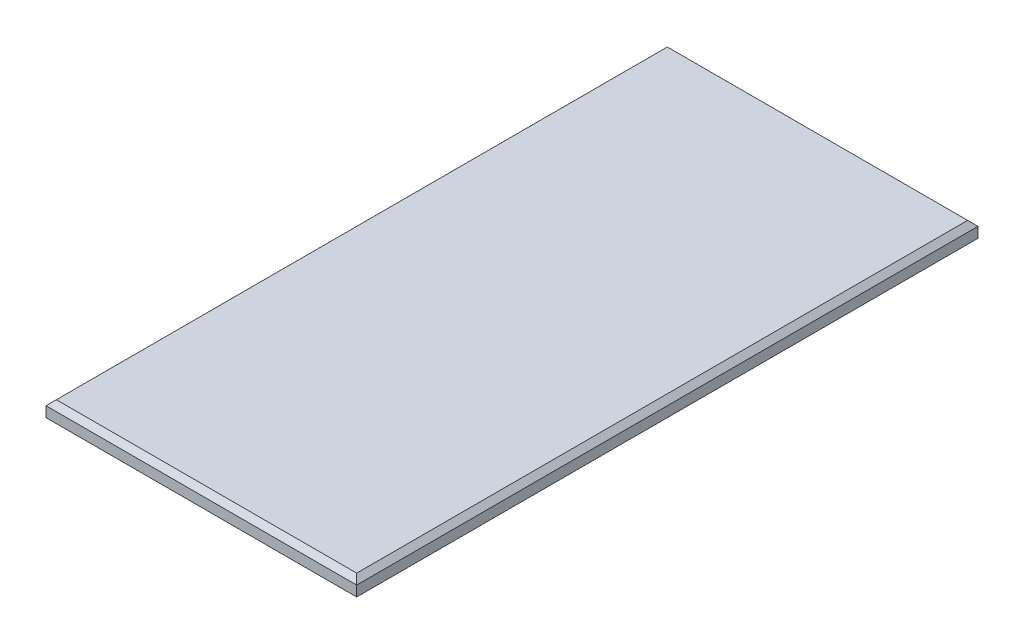
ISO-10303-21;
HEADER;
FILE_DESCRIPTION(('STEP AP214'),'2;1');
FILE_NAME('part.step','',(''),(''),'','','');
FILE_SCHEMA(('AUTOMOTIVE_DESIGN { 1 0 10303 214 1 1 1 1 }'));
ENDSEC;
DATA;
#1=APPLICATION_CONTEXT('core data for automotive mechanical design processes');
#2=APPLICATION_PROTOCOL_DEFINITION('international standard','automotive_design',2000,#1);
#3=PRODUCT_CONTEXT('',#1,'mechanical');
#4=PRODUCT('Part','Part','',(#3));
#5=PRODUCT_RELATED_PRODUCT_CATEGORY('part','',(#4));
#6=PRODUCT_DEFINITION_FORMATION('','',#4);
#7=PRODUCT_DEFINITION_CONTEXT('part definition',#1,'design');
#8=PRODUCT_DEFINITION('design','',#6,#7);
#9=PRODUCT_DEFINITION_SHAPE('','',#8);
#10=(LENGTH_UNIT() NAMED_UNIT(*) SI_UNIT(.MILLI.,.METRE.));
#11=(NAMED_UNIT(*) PLANE_ANGLE_UNIT() SI_UNIT($,.RADIAN.));
#12=(NAMED_UNIT(*) SI_UNIT($,.STERADIAN.) SOLID_ANGLE_UNIT());
#13=UNCERTAINTY_MEASURE_WITH_UNIT(LENGTH_MEASURE(1.E-05),#10,'distance_accuracy_value','');
#14=(GEOMETRIC_REPRESENTATION_CONTEXT(3) GLOBAL_UNCERTAINTY_ASSIGNED_CONTEXT((#13)) GLOBAL_UNIT_ASSIGNED_CONTEXT((#10,
#11,#12)) REPRESENTATION_CONTEXT('',''));
#15=CARTESIAN_POINT('',(0.,0.,0.));
#16=DIRECTION('',(0.,0.,1.));
#17=DIRECTION('',(1.,0.,0.));
#18=AXIS2_PLACEMENT_3D('',#15,#16,#17);
#19=CARTESIAN_POINT('',(-150.,15.,300.));
#20=DIRECTION('',(0.,0.,-1.));
#21=DIRECTION('',(-1.,0.,0.));
#22=AXIS2_PLACEMENT_3D('',#19,#20,#21);
#23=PLANE('',#22);
#24=DIRECTION('',(0.,-1.,0.));
#25=VECTOR('',#24,1.);
#26=CARTESIAN_POINT('',(150.,15.,300.));
#27=LINE('',#26,#25);
#28=CARTESIAN_POINT('',(150.,9.99999999999999,300.));
#29=VERTEX_POINT('',#28);
#30=CARTESIAN_POINT('',(150.,0.,300.));
#31=VERTEX_POINT('',#30);
#32=EDGE_CURVE('E97',#29,#31,#27,.T.);
#33=ORIENTED_EDGE('',*,*,#32,.F.);
#34=DIRECTION('',(-1.,0.,0.));
#35=VECTOR('',#34,1.);
#36=CARTESIAN_POINT('',(-150.,9.99999999999999,300.));
#37=LINE('',#36,#35);
#38=CARTESIAN_POINT('',(-150.,9.99999999999999,300.));
#39=VERTEX_POINT('',#38);
#40=EDGE_CURVE('E152',#29,#39,#37,.T.);
#41=ORIENTED_EDGE('',*,*,#40,.T.);
#42=DIRECTION('',(0.,-1.,0.));
#43=VECTOR('',#42,1.);
#44=CARTESIAN_POINT('',(-150.,15.,300.));
#45=LINE('',#44,#43);
#46=CARTESIAN_POINT('',(-150.,0.,300.));
#47=VERTEX_POINT('',#46);
#48=EDGE_CURVE('E121',#39,#47,#45,.T.);
#49=ORIENTED_EDGE('',*,*,#48,.T.);
#50=DIRECTION('',(1.,0.,0.));
#51=VECTOR('',#50,1.);
#52=CARTESIAN_POINT('',(-150.,0.,300.));
#53=LINE('',#52,#51);
#54=EDGE_CURVE('E115',#47,#31,#53,.T.);
#55=ORIENTED_EDGE('',*,*,#54,.T.);
#56=EDGE_LOOP('',(#33,#41,#49,#55));
#57=FACE_BOUND('',#56,.T.);
#58=ADVANCED_FACE('F41',(#57),#23,.F.);
#59=CARTESIAN_POINT('',(150.,15.,300.));
#60=DIRECTION('',(-1.,0.,0.));
#61=DIRECTION('',(0.,0.,1.));
#62=AXIS2_PLACEMENT_3D('',#59,#60,#61);
#63=PLANE('',#62);
#64=DIRECTION('',(0.,-1.,0.));
#65=VECTOR('',#64,1.);
#66=CARTESIAN_POINT('',(150.,15.,-300.));
#67=LINE('',#66,#65);
#68=CARTESIAN_POINT('',(150.,9.99999999999999,-300.));
#69=VERTEX_POINT('',#68);
#70=CARTESIAN_POINT('',(150.,0.,-300.));
#71=VERTEX_POINT('',#70);
#72=EDGE_CURVE('E109',#69,#71,#67,.T.);
#73=ORIENTED_EDGE('',*,*,#72,.F.);
#74=DIRECTION('',(0.,0.,1.));
#75=VECTOR('',#74,1.);
#76=CARTESIAN_POINT('',(150.,9.99999999999999,300.));
#77=LINE('',#76,#75);
#78=EDGE_CURVE('E11',#69,#29,#77,.T.);
#79=ORIENTED_EDGE('',*,*,#78,.T.);
#80=ORIENTED_EDGE('',*,*,#32,.T.);
#81=DIRECTION('',(0.,0.,-1.));
#82=VECTOR('',#81,1.);
#83=CARTESIAN_POINT('',(150.,0.,300.));
#84=LINE('',#83,#82);
#85=EDGE_CURVE('E100',#31,#71,#84,.T.);
#86=ORIENTED_EDGE('',*,*,#85,.T.);
#87=EDGE_LOOP('',(#73,#79,#80,#86));
#88=FACE_BOUND('',#87,.T.);
#89=ADVANCED_FACE('F99',(#88),#63,.F.);
#90=CARTESIAN_POINT('',(-150.,15.,-300.));
#91=DIRECTION('',(0.,0.,-1.));
#92=DIRECTION('',(-1.,0.,0.));
#93=AXIS2_PLACEMENT_3D('',#90,#91,#92);
#94=PLANE('',#93);
#95=DIRECTION('',(0.,-1.,0.));
#96=VECTOR('',#95,1.);
#97=CARTESIAN_POINT('',(-150.,15.,-300.));
#98=LINE('',#97,#96);
#99=CARTESIAN_POINT('',(-150.,9.99999999999999,-300.));
#100=VERTEX_POINT('',#99);
#101=CARTESIAN_POINT('',(-150.,0.,-300.));
#102=VERTEX_POINT('',#101);
#103=EDGE_CURVE('E135',#100,#102,#98,.T.);
#104=ORIENTED_EDGE('',*,*,#103,.F.);
#105=DIRECTION('',(1.,0.,0.));
#106=VECTOR('',#105,1.);
#107=CARTESIAN_POINT('',(-150.,9.99999999999999,-300.));
#108=LINE('',#107,#106);
#109=EDGE_CURVE('E52',#100,#69,#108,.T.);
#110=ORIENTED_EDGE('',*,*,#109,.T.);
#111=ORIENTED_EDGE('',*,*,#72,.T.);
#112=DIRECTION('',(1.,0.,0.));
#113=VECTOR('',#112,1.);
#114=CARTESIAN_POINT('',(-150.,0.,-300.));
#115=LINE('',#114,#113);
#116=EDGE_CURVE('E118',#102,#71,#115,.T.);
#117=ORIENTED_EDGE('',*,*,#116,.F.);
#118=EDGE_LOOP('',(#104,#110,#111,#117));
#119=FACE_BOUND('',#118,.T.);
#120=ADVANCED_FACE('F182',(#119),#94,.T.);
#121=CARTESIAN_POINT('',(-150.,15.,300.));
#122=DIRECTION('',(-1.,0.,0.));
#123=DIRECTION('',(0.,0.,1.));
#124=AXIS2_PLACEMENT_3D('',#121,#122,#123);
#125=PLANE('',#124);
#126=ORIENTED_EDGE('',*,*,#48,.F.);
#127=DIRECTION('',(0.,0.,-1.));
#128=VECTOR('',#127,1.);
#129=CARTESIAN_POINT('',(-150.,9.99999999999999,300.));
#130=LINE('',#129,#128);
#131=EDGE_CURVE('E67',#39,#100,#130,.T.);
#132=ORIENTED_EDGE('',*,*,#131,.T.);
#133=ORIENTED_EDGE('',*,*,#103,.T.);
#134=DIRECTION('',(0.,0.,-1.));
#135=VECTOR('',#134,1.);
#136=CARTESIAN_POINT('',(-150.,0.,300.));
#137=LINE('',#136,#135);
#138=EDGE_CURVE('E130',#47,#102,#137,.T.);
#139=ORIENTED_EDGE('',*,*,#138,.F.);
#140=EDGE_LOOP('',(#126,#132,#133,#139));
#141=FACE_BOUND('',#140,.T.);
#142=ADVANCED_FACE('F181',(#141),#125,.T.);
#143=CARTESIAN_POINT('',(0.,15.,0.));
#144=DIRECTION('',(0.,1.,0.));
#145=DIRECTION('',(0.,0.,1.));
#146=AXIS2_PLACEMENT_3D('',#143,#144,#145);
#147=PLANE('',#146);
#148=DIRECTION('',(0.,0.,1.));
#149=VECTOR('',#148,1.);
#150=CARTESIAN_POINT('',(-145.,15.,0.));
#151=LINE('',#150,#149);
#152=CARTESIAN_POINT('',(-145.,15.,-295.));
#153=VERTEX_POINT('',#152);
#154=CARTESIAN_POINT('',(-145.,15.,295.));
#155=VERTEX_POINT('',#154);
#156=EDGE_CURVE('E145',#153,#155,#151,.T.);
#157=ORIENTED_EDGE('',*,*,#156,.T.);
#158=DIRECTION('',(1.,0.,0.));
#159=VECTOR('',#158,1.);
#160=CARTESIAN_POINT('',(150.,15.,295.));
#161=LINE('',#160,#159);
#162=CARTESIAN_POINT('',(145.,15.,295.));
#163=VERTEX_POINT('',#162);
#164=EDGE_CURVE('E148',#155,#163,#161,.T.);
#165=ORIENTED_EDGE('',*,*,#164,.T.);
#166=DIRECTION('',(0.,0.,-1.));
#167=VECTOR('',#166,1.);
#168=CARTESIAN_POINT('',(145.,15.,-300.));
#169=LINE('',#168,#167);
#170=CARTESIAN_POINT('',(145.,15.,-295.));
#171=VERTEX_POINT('',#170);
#172=EDGE_CURVE('E108',#163,#171,#169,.T.);
#173=ORIENTED_EDGE('',*,*,#172,.T.);
#174=DIRECTION('',(-1.,0.,0.));
#175=VECTOR('',#174,1.);
#176=CARTESIAN_POINT('',(0.,15.,-295.));
#177=LINE('',#176,#175);
#178=EDGE_CURVE('E142',#171,#153,#177,.T.);
#179=ORIENTED_EDGE('',*,*,#178,.T.);
#180=EDGE_LOOP('',(#157,#165,#173,#179));
#181=FACE_BOUND('',#180,.T.);
#182=ADVANCED_FACE('F176',(#181),#147,.T.);
#183=CARTESIAN_POINT('',(0.,0.,0.));
#184=DIRECTION('',(0.,1.,0.));
#185=DIRECTION('',(0.,0.,1.));
#186=AXIS2_PLACEMENT_3D('',#183,#184,#185);
#187=PLANE('',#186);
#188=ORIENTED_EDGE('',*,*,#54,.F.);
#189=ORIENTED_EDGE('',*,*,#138,.T.);
#190=ORIENTED_EDGE('',*,*,#116,.T.);
#191=ORIENTED_EDGE('',*,*,#85,.F.);
#192=EDGE_LOOP('',(#188,#189,#190,#191));
#193=FACE_BOUND('',#192,.T.);
#194=ADVANCED_FACE('F113',(#193),#187,.F.);
#195=CARTESIAN_POINT('',(-150.,9.99999999999999,-300.));
#196=DIRECTION('',(0.,-0.707106781186547,0.707106781186547));
#197=DIRECTION('',(1.,0.,0.));
#198=AXIS2_PLACEMENT_3D('',#195,#196,#197);
#199=PLANE('',#198);
#200=DIRECTION('',(0.577350269189626,-0.577350269189626,-0.577350269189626));
#201=VECTOR('',#200,1.);
#202=CARTESIAN_POINT('',(46.6666666666667,113.333333333333,-196.666666666667));
#203=LINE('',#202,#201);
#204=EDGE_CURVE('E126',#69,#171,#203,.F.);
#205=ORIENTED_EDGE('',*,*,#204,.F.);
#206=ORIENTED_EDGE('',*,*,#109,.F.);
#207=DIRECTION('',(0.577350269189626,0.577350269189626,0.577350269189626));
#208=VECTOR('',#207,1.);
#209=CARTESIAN_POINT('',(-150.,9.99999999999999,-300.));
#210=LINE('',#209,#208);
#211=EDGE_CURVE('E46',#153,#100,#210,.F.);
#212=ORIENTED_EDGE('',*,*,#211,.F.);
#213=ORIENTED_EDGE('',*,*,#178,.F.);
#214=EDGE_LOOP('',(#205,#206,#212,#213));
#215=FACE_BOUND('',#214,.T.);
#216=ADVANCED_FACE('F44',(#215),#199,.F.);
#217=CARTESIAN_POINT('',(-150.,9.99999999999999,300.));
#218=DIRECTION('',(0.707106781186547,-0.707106781186547,0.));
#219=DIRECTION('',(0.,0.,-1.));
#220=AXIS2_PLACEMENT_3D('',#217,#218,#219);
#221=PLANE('',#220);
#222=ORIENTED_EDGE('',*,*,#211,.T.);
#223=ORIENTED_EDGE('',*,*,#131,.F.);
#224=DIRECTION('',(-0.577350269189626,-0.577350269189626,0.577350269189626));
#225=VECTOR('',#224,1.);
#226=CARTESIAN_POINT('',(-150.,9.99999999999999,300.));
#227=LINE('',#226,#225);
#228=EDGE_CURVE('E162',#155,#39,#227,.T.);
#229=ORIENTED_EDGE('',*,*,#228,.F.);
#230=ORIENTED_EDGE('',*,*,#156,.F.);
#231=EDGE_LOOP('',(#222,#223,#229,#230));
#232=FACE_BOUND('',#231,.T.);
#233=ADVANCED_FACE('F206',(#232),#221,.F.);
#234=CARTESIAN_POINT('',(145.,15.,0.));
#235=DIRECTION('',(0.707106781186547,0.707106781186547,0.));
#236=DIRECTION('',(0.,0.,1.));
#237=AXIS2_PLACEMENT_3D('',#234,#235,#236);
#238=PLANE('',#237);
#239=ORIENTED_EDGE('',*,*,#204,.T.);
#240=ORIENTED_EDGE('',*,*,#172,.F.);
#241=DIRECTION('',(0.577350269189626,-0.577350269189626,0.577350269189626));
#242=VECTOR('',#241,1.);
#243=CARTESIAN_POINT('',(46.6666666666667,113.333333333333,196.666666666667));
#244=LINE('',#243,#242);
#245=EDGE_CURVE('E159',#29,#163,#244,.F.);
#246=ORIENTED_EDGE('',*,*,#245,.F.);
#247=ORIENTED_EDGE('',*,*,#78,.F.);
#248=EDGE_LOOP('',(#239,#240,#246,#247));
#249=FACE_BOUND('',#248,.T.);
#250=ADVANCED_FACE('F169',(#249),#238,.T.);
#251=CARTESIAN_POINT('',(0.,15.,295.));
#252=DIRECTION('',(0.,0.707106781186547,0.707106781186547));
#253=DIRECTION('',(-1.,0.,0.));
#254=AXIS2_PLACEMENT_3D('',#251,#252,#253);
#255=PLANE('',#254);
#256=ORIENTED_EDGE('',*,*,#228,.T.);
#257=ORIENTED_EDGE('',*,*,#40,.F.);
#258=ORIENTED_EDGE('',*,*,#245,.T.);
#259=ORIENTED_EDGE('',*,*,#164,.F.);
#260=EDGE_LOOP('',(#256,#257,#258,#259));
#261=FACE_BOUND('',#260,.T.);
#262=ADVANCED_FACE('F180',(#261),#255,.T.);
#263=CLOSED_SHELL('',(#58,#89,#120,#142,#182,#194,#216,#233,#250,#262));
#264=MANIFOLD_SOLID_BREP('B2',#263);
#265=ADVANCED_BREP_SHAPE_REPRESENTATION('',(#18,#264),#14);
#266=SHAPE_DEFINITION_REPRESENTATION(#9,#265);
ENDSEC;
END-ISO-10303-21;
